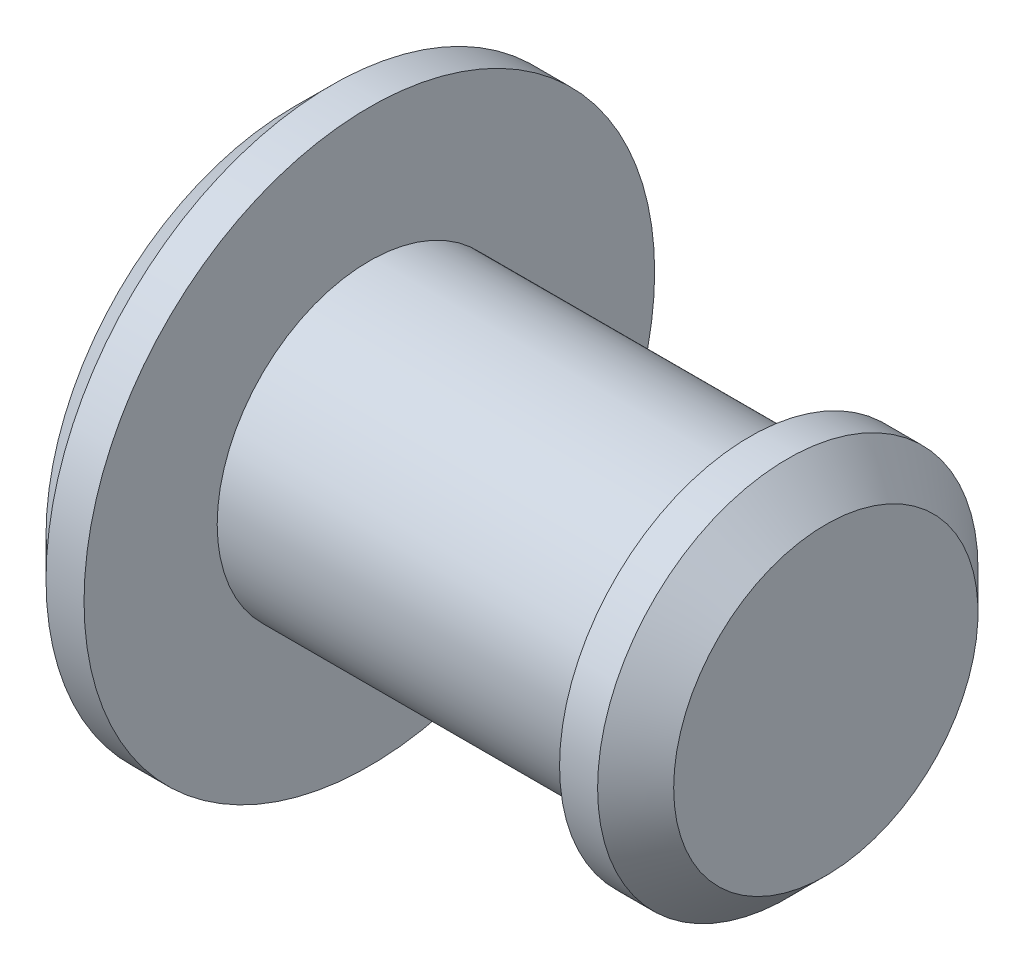
ISO-10303-21;
HEADER;
FILE_DESCRIPTION(('STEP AP214'),'2;1');
FILE_NAME('part.step','',(''),(''),'','','');
FILE_SCHEMA(('AUTOMOTIVE_DESIGN { 1 0 10303 214 1 1 1 1 }'));
ENDSEC;
DATA;
#1=APPLICATION_CONTEXT('core data for automotive mechanical design processes');
#2=APPLICATION_PROTOCOL_DEFINITION('international standard','automotive_design',2000,#1);
#3=PRODUCT_CONTEXT('',#1,'mechanical');
#4=PRODUCT('Part','Part','',(#3));
#5=PRODUCT_RELATED_PRODUCT_CATEGORY('part','',(#4));
#6=PRODUCT_DEFINITION_FORMATION('','',#4);
#7=PRODUCT_DEFINITION_CONTEXT('part definition',#1,'design');
#8=PRODUCT_DEFINITION('design','',#6,#7);
#9=PRODUCT_DEFINITION_SHAPE('','',#8);
#10=(LENGTH_UNIT() NAMED_UNIT(*) SI_UNIT(.MILLI.,.METRE.));
#11=(NAMED_UNIT(*) PLANE_ANGLE_UNIT() SI_UNIT($,.RADIAN.));
#12=(NAMED_UNIT(*) SI_UNIT($,.STERADIAN.) SOLID_ANGLE_UNIT());
#13=UNCERTAINTY_MEASURE_WITH_UNIT(LENGTH_MEASURE(1.E-05),#10,'distance_accuracy_value','');
#14=(GEOMETRIC_REPRESENTATION_CONTEXT(3) GLOBAL_UNCERTAINTY_ASSIGNED_CONTEXT((#13)) GLOBAL_UNIT_ASSIGNED_CONTEXT((#10,
#11,#12)) REPRESENTATION_CONTEXT('',''));
#15=CARTESIAN_POINT('',(0.,0.,0.));
#16=DIRECTION('',(0.,0.,1.));
#17=DIRECTION('',(1.,0.,0.));
#18=AXIS2_PLACEMENT_3D('',#15,#16,#17);
#19=CARTESIAN_POINT('',(0.,0.,0.));
#20=DIRECTION('',(1.,0.,0.));
#21=DIRECTION('',(0.,0.,-1.));
#22=AXIS2_PLACEMENT_3D('',#19,#20,#21);
#23=PLANE('',#22);
#24=CARTESIAN_POINT('',(0.,0.,0.));
#25=DIRECTION('',(1.,0.,0.));
#26=DIRECTION('',(0.,0.,-1.));
#27=AXIS2_PLACEMENT_3D('',#24,#25,#26);
#28=CIRCLE('',#27,3.25);
#29=CARTESIAN_POINT('',(0.,0.,-3.25));
#30=VERTEX_POINT('',#29);
#31=EDGE_CURVE('E44',#30,#30,#28,.F.);
#32=ORIENTED_EDGE('',*,*,#31,.T.);
#33=EDGE_LOOP('',(#32));
#34=FACE_BOUND('',#33,.T.);
#35=ADVANCED_FACE('F36',(#34),#23,.F.);
#36=CARTESIAN_POINT('',(-5.17348398906822,0.,0.));
#37=DIRECTION('',(-1.,0.,0.));
#38=DIRECTION('',(0.,0.,1.));
#39=AXIS2_PLACEMENT_3D('',#36,#37,#38);
#40=CYLINDRICAL_SURFACE('',#39,3.75);
#41=CARTESIAN_POINT('',(0.5,0.,0.));
#42=DIRECTION('',(1.,0.,0.));
#43=DIRECTION('',(0.,0.,-1.));
#44=AXIS2_PLACEMENT_3D('',#41,#42,#43);
#45=CIRCLE('',#44,3.75);
#46=CARTESIAN_POINT('',(0.5,0.,-3.75));
#47=VERTEX_POINT('',#46);
#48=EDGE_CURVE('E10',#47,#47,#45,.T.);
#49=ORIENTED_EDGE('',*,*,#48,.T.);
#50=EDGE_LOOP('',(#49));
#51=FACE_BOUND('',#50,.T.);
#52=CARTESIAN_POINT('',(1.,0.,0.));
#53=DIRECTION('',(-1.,0.,0.));
#54=DIRECTION('',(0.,0.,1.));
#55=AXIS2_PLACEMENT_3D('',#52,#53,#54);
#56=CIRCLE('',#55,3.75);
#57=CARTESIAN_POINT('',(1.,0.,3.75));
#58=VERTEX_POINT('',#57);
#59=EDGE_CURVE('E57',#58,#58,#56,.T.);
#60=ORIENTED_EDGE('',*,*,#59,.T.);
#61=EDGE_LOOP('',(#60));
#62=FACE_BOUND('',#61,.T.);
#63=ADVANCED_FACE('F88',(#51,#62),#40,.T.);
#64=CARTESIAN_POINT('',(1.,3.75,0.));
#65=DIRECTION('',(-1.,0.,0.));
#66=DIRECTION('',(0.,0.,1.));
#67=AXIS2_PLACEMENT_3D('',#64,#65,#66);
#68=PLANE('',#67);
#69=ORIENTED_EDGE('',*,*,#59,.F.);
#70=EDGE_LOOP('',(#69));
#71=FACE_BOUND('',#70,.T.);
#72=CARTESIAN_POINT('',(1.,0.,0.));
#73=DIRECTION('',(-1.,0.,0.));
#74=DIRECTION('',(0.,0.,1.));
#75=AXIS2_PLACEMENT_3D('',#72,#73,#74);
#76=CIRCLE('',#75,2.);
#77=CARTESIAN_POINT('',(1.,0.,2.));
#78=VERTEX_POINT('',#77);
#79=EDGE_CURVE('E60',#78,#78,#76,.T.);
#80=ORIENTED_EDGE('',*,*,#79,.T.);
#81=EDGE_LOOP('',(#80));
#82=FACE_BOUND('',#81,.T.);
#83=ADVANCED_FACE('F93',(#71,#82),#68,.F.);
#84=CARTESIAN_POINT('',(-5.17348398906822,0.,0.));
#85=DIRECTION('',(-1.,0.,0.));
#86=DIRECTION('',(0.,0.,1.));
#87=AXIS2_PLACEMENT_3D('',#84,#85,#86);
#88=CYLINDRICAL_SURFACE('',#87,2.);
#89=ORIENTED_EDGE('',*,*,#79,.F.);
#90=EDGE_LOOP('',(#89));
#91=FACE_BOUND('',#90,.T.);
#92=CARTESIAN_POINT('',(6.,0.,0.));
#93=DIRECTION('',(-1.,0.,0.));
#94=DIRECTION('',(0.,0.,1.));
#95=AXIS2_PLACEMENT_3D('',#92,#93,#94);
#96=CIRCLE('',#95,2.);
#97=CARTESIAN_POINT('',(6.,0.,2.));
#98=VERTEX_POINT('',#97);
#99=EDGE_CURVE('E63',#98,#98,#96,.T.);
#100=ORIENTED_EDGE('',*,*,#99,.T.);
#101=EDGE_LOOP('',(#100));
#102=FACE_BOUND('',#101,.T.);
#103=ADVANCED_FACE('F84',(#91,#102),#88,.T.);
#104=CARTESIAN_POINT('',(6.,2.,0.));
#105=DIRECTION('',(1.,0.,0.));
#106=DIRECTION('',(0.,0.,-1.));
#107=AXIS2_PLACEMENT_3D('',#104,#105,#106);
#108=PLANE('',#107);
#109=ORIENTED_EDGE('',*,*,#99,.F.);
#110=EDGE_LOOP('',(#109));
#111=FACE_BOUND('',#110,.T.);
#112=CARTESIAN_POINT('',(6.,0.,0.));
#113=DIRECTION('',(-1.,0.,0.));
#114=DIRECTION('',(0.,0.,1.));
#115=AXIS2_PLACEMENT_3D('',#112,#113,#114);
#116=CIRCLE('',#115,2.5);
#117=CARTESIAN_POINT('',(6.,0.,2.5));
#118=VERTEX_POINT('',#117);
#119=EDGE_CURVE('E66',#118,#118,#116,.T.);
#120=ORIENTED_EDGE('',*,*,#119,.T.);
#121=EDGE_LOOP('',(#120));
#122=FACE_BOUND('',#121,.T.);
#123=ADVANCED_FACE('F70',(#111,#122),#108,.F.);
#124=CARTESIAN_POINT('',(-5.17348398906822,0.,0.));
#125=DIRECTION('',(-1.,0.,0.));
#126=DIRECTION('',(0.,0.,1.));
#127=AXIS2_PLACEMENT_3D('',#124,#125,#126);
#128=CYLINDRICAL_SURFACE('',#127,2.5);
#129=CARTESIAN_POINT('',(6.5,0.,0.));
#130=DIRECTION('',(-1.,0.,0.));
#131=DIRECTION('',(0.,0.,1.));
#132=AXIS2_PLACEMENT_3D('',#129,#130,#131);
#133=CIRCLE('',#132,2.5);
#134=CARTESIAN_POINT('',(6.5,0.,2.5));
#135=VERTEX_POINT('',#134);
#136=EDGE_CURVE('E52',#135,#135,#133,.T.);
#137=ORIENTED_EDGE('',*,*,#136,.T.);
#138=EDGE_LOOP('',(#137));
#139=FACE_BOUND('',#138,.T.);
#140=ORIENTED_EDGE('',*,*,#119,.F.);
#141=EDGE_LOOP('',(#140));
#142=FACE_BOUND('',#141,.T.);
#143=ADVANCED_FACE('F72',(#139,#142),#128,.T.);
#144=CARTESIAN_POINT('',(7.,2.5,0.));
#145=DIRECTION('',(-1.,0.,0.));
#146=DIRECTION('',(0.,0.,1.));
#147=AXIS2_PLACEMENT_3D('',#144,#145,#146);
#148=PLANE('',#147);
#149=CARTESIAN_POINT('',(7.,0.,0.));
#150=DIRECTION('',(-1.,0.,0.));
#151=DIRECTION('',(0.,0.,1.));
#152=AXIS2_PLACEMENT_3D('',#149,#150,#151);
#153=CIRCLE('',#152,2.);
#154=CARTESIAN_POINT('',(7.,0.,2.));
#155=VERTEX_POINT('',#154);
#156=EDGE_CURVE('E48',#155,#155,#153,.F.);
#157=ORIENTED_EDGE('',*,*,#156,.T.);
#158=EDGE_LOOP('',(#157));
#159=FACE_BOUND('',#158,.T.);
#160=ADVANCED_FACE('F74',(#159),#148,.F.);
#161=CARTESIAN_POINT('',(6.5,0.,0.));
#162=DIRECTION('',(-1.,0.,0.));
#163=DIRECTION('',(0.,0.,1.));
#164=AXIS2_PLACEMENT_3D('',#161,#162,#163);
#165=CONICAL_SURFACE('',#164,2.5,0.78539816339745);
#166=ORIENTED_EDGE('',*,*,#156,.F.);
#167=EDGE_LOOP('',(#166));
#168=FACE_BOUND('',#167,.T.);
#169=ORIENTED_EDGE('',*,*,#136,.F.);
#170=EDGE_LOOP('',(#169));
#171=FACE_BOUND('',#170,.T.);
#172=ADVANCED_FACE('F81',(#168,#171),#165,.T.);
#173=CARTESIAN_POINT('',(0.,0.,0.));
#174=DIRECTION('',(1.,0.,0.));
#175=DIRECTION('',(0.,0.,-1.));
#176=AXIS2_PLACEMENT_3D('',#173,#174,#175);
#177=CONICAL_SURFACE('',#176,3.25,0.785398163397448);
#178=ORIENTED_EDGE('',*,*,#48,.F.);
#179=EDGE_LOOP('',(#178));
#180=FACE_BOUND('',#179,.T.);
#181=ORIENTED_EDGE('',*,*,#31,.F.);
#182=EDGE_LOOP('',(#181));
#183=FACE_BOUND('',#182,.T.);
#184=ADVANCED_FACE('F39',(#180,#183),#177,.T.);
#185=CLOSED_SHELL('',(#35,#63,#83,#103,#123,#143,#160,#172,#184));
#186=MANIFOLD_SOLID_BREP('B2',#185);
#187=ADVANCED_BREP_SHAPE_REPRESENTATION('',(#18,#186),#14);
#188=SHAPE_DEFINITION_REPRESENTATION(#9,#187);
ENDSEC;
END-ISO-10303-21;
